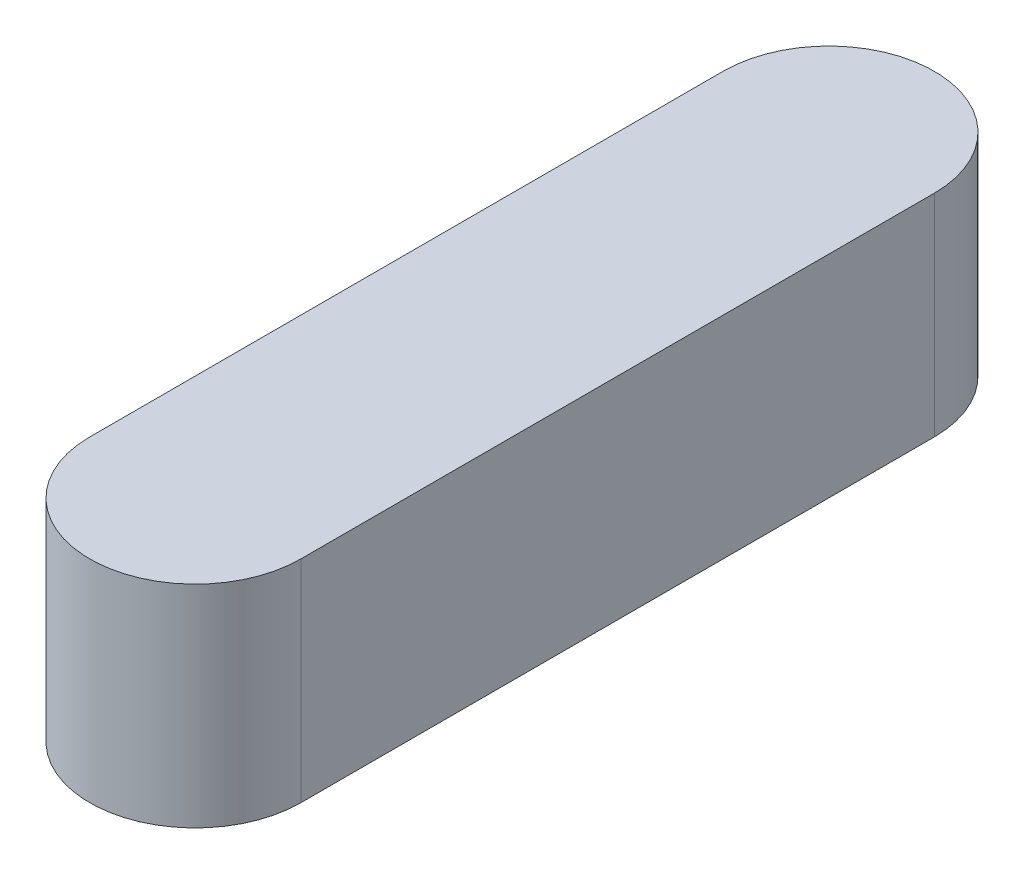
ISO-10303-21;
HEADER;
FILE_DESCRIPTION(('STEP AP214'),'2;1');
FILE_NAME('part.step','',(''),(''),'','','');
FILE_SCHEMA(('AUTOMOTIVE_DESIGN { 1 0 10303 214 1 1 1 1 }'));
ENDSEC;
DATA;
#1=APPLICATION_CONTEXT('core data for automotive mechanical design processes');
#2=APPLICATION_PROTOCOL_DEFINITION('international standard','automotive_design',2000,#1);
#3=PRODUCT_CONTEXT('',#1,'mechanical');
#4=PRODUCT('Part','Part','',(#3));
#5=PRODUCT_RELATED_PRODUCT_CATEGORY('part','',(#4));
#6=PRODUCT_DEFINITION_FORMATION('','',#4);
#7=PRODUCT_DEFINITION_CONTEXT('part definition',#1,'design');
#8=PRODUCT_DEFINITION('design','',#6,#7);
#9=PRODUCT_DEFINITION_SHAPE('','',#8);
#10=(LENGTH_UNIT() NAMED_UNIT(*) SI_UNIT(.MILLI.,.METRE.));
#11=(NAMED_UNIT(*) PLANE_ANGLE_UNIT() SI_UNIT($,.RADIAN.));
#12=(NAMED_UNIT(*) SI_UNIT($,.STERADIAN.) SOLID_ANGLE_UNIT());
#13=UNCERTAINTY_MEASURE_WITH_UNIT(LENGTH_MEASURE(1.E-05),#10,'distance_accuracy_value','');
#14=(GEOMETRIC_REPRESENTATION_CONTEXT(3) GLOBAL_UNCERTAINTY_ASSIGNED_CONTEXT((#13)) GLOBAL_UNIT_ASSIGNED_CONTEXT((#10,
#11,#12)) REPRESENTATION_CONTEXT('',''));
#15=CARTESIAN_POINT('',(0.,0.,0.));
#16=DIRECTION('',(0.,0.,1.));
#17=DIRECTION('',(1.,0.,0.));
#18=AXIS2_PLACEMENT_3D('',#15,#16,#17);
#19=CARTESIAN_POINT('',(0.,3.,0.));
#20=DIRECTION('',(0.,1.,0.));
#21=DIRECTION('',(0.,0.,1.));
#22=AXIS2_PLACEMENT_3D('',#19,#20,#21);
#23=PLANE('',#22);
#24=CARTESIAN_POINT('',(1.5,3.,10.5));
#25=DIRECTION('',(0.,1.,0.));
#26=DIRECTION('',(-1.,0.,0.));
#27=AXIS2_PLACEMENT_3D('',#24,#25,#26);
#28=CIRCLE('',#27,1.5);
#29=CARTESIAN_POINT('',(3.,3.,10.5));
#30=VERTEX_POINT('',#29);
#31=CARTESIAN_POINT('',(0.,3.,10.5));
#32=VERTEX_POINT('',#31);
#33=EDGE_CURVE('E81',#30,#32,#28,.F.);
#34=ORIENTED_EDGE('',*,*,#33,.F.);
#35=DIRECTION('',(0.,0.,-1.));
#36=VECTOR('',#35,1.);
#37=CARTESIAN_POINT('',(3.,3.,0.));
#38=LINE('',#37,#36);
#39=CARTESIAN_POINT('',(3.,3.,1.5));
#40=VERTEX_POINT('',#39);
#41=EDGE_CURVE('E60',#40,#30,#38,.F.);
#42=ORIENTED_EDGE('',*,*,#41,.F.);
#43=CARTESIAN_POINT('',(1.5,3.,1.5));
#44=DIRECTION('',(0.,-1.,0.));
#45=DIRECTION('',(1.,0.,0.));
#46=AXIS2_PLACEMENT_3D('',#43,#44,#45);
#47=CIRCLE('',#46,1.5);
#48=CARTESIAN_POINT('',(0.,3.,1.5));
#49=VERTEX_POINT('',#48);
#50=EDGE_CURVE('E20',#49,#40,#47,.T.);
#51=ORIENTED_EDGE('',*,*,#50,.F.);
#52=DIRECTION('',(0.,0.,1.));
#53=VECTOR('',#52,1.);
#54=CARTESIAN_POINT('',(0.,3.,0.));
#55=LINE('',#54,#53);
#56=EDGE_CURVE('E58',#32,#49,#55,.F.);
#57=ORIENTED_EDGE('',*,*,#56,.F.);
#58=EDGE_LOOP('',(#34,#42,#51,#57));
#59=FACE_BOUND('',#58,.T.);
#60=ADVANCED_FACE('F17',(#59),#23,.T.);
#61=CARTESIAN_POINT('',(1.5,0.75,1.5));
#62=DIRECTION('',(0.,-1.,0.));
#63=DIRECTION('',(1.,0.,0.));
#64=AXIS2_PLACEMENT_3D('',#61,#62,#63);
#65=CYLINDRICAL_SURFACE('',#64,1.5);
#66=ORIENTED_EDGE('',*,*,#50,.T.);
#67=DIRECTION('',(0.,1.,0.));
#68=VECTOR('',#67,1.);
#69=CARTESIAN_POINT('',(3.,3.,1.5));
#70=LINE('',#69,#68);
#71=CARTESIAN_POINT('',(3.,0.,1.5));
#72=VERTEX_POINT('',#71);
#73=EDGE_CURVE('E63',#72,#40,#70,.T.);
#74=ORIENTED_EDGE('',*,*,#73,.F.);
#75=CARTESIAN_POINT('',(1.5,0.,1.5));
#76=DIRECTION('',(0.,-1.,0.));
#77=DIRECTION('',(1.,0.,0.));
#78=AXIS2_PLACEMENT_3D('',#75,#76,#77);
#79=CIRCLE('',#78,1.5);
#80=CARTESIAN_POINT('',(0.,0.,1.5));
#81=VERTEX_POINT('',#80);
#82=EDGE_CURVE('E68',#81,#72,#79,.T.);
#83=ORIENTED_EDGE('',*,*,#82,.F.);
#84=DIRECTION('',(0.,1.,0.));
#85=VECTOR('',#84,1.);
#86=CARTESIAN_POINT('',(0.,0.,1.5));
#87=LINE('',#86,#85);
#88=EDGE_CURVE('E65',#49,#81,#87,.F.);
#89=ORIENTED_EDGE('',*,*,#88,.F.);
#90=EDGE_LOOP('',(#66,#74,#83,#89));
#91=FACE_BOUND('',#90,.T.);
#92=ADVANCED_FACE('F66',(#91),#65,.T.);
#93=CARTESIAN_POINT('',(3.,3.,0.));
#94=DIRECTION('',(1.,0.,0.));
#95=DIRECTION('',(0.,0.,-1.));
#96=AXIS2_PLACEMENT_3D('',#93,#94,#95);
#97=PLANE('',#96);
#98=DIRECTION('',(0.,1.,0.));
#99=VECTOR('',#98,1.);
#100=CARTESIAN_POINT('',(3.,0.75,10.5));
#101=LINE('',#100,#99);
#102=CARTESIAN_POINT('',(3.,0.,10.5));
#103=VERTEX_POINT('',#102);
#104=EDGE_CURVE('E70',#103,#30,#101,.T.);
#105=ORIENTED_EDGE('',*,*,#104,.F.);
#106=DIRECTION('',(0.,0.,-1.));
#107=VECTOR('',#106,1.);
#108=CARTESIAN_POINT('',(3.,0.,0.));
#109=LINE('',#108,#107);
#110=EDGE_CURVE('E74',#72,#103,#109,.F.);
#111=ORIENTED_EDGE('',*,*,#110,.F.);
#112=ORIENTED_EDGE('',*,*,#73,.T.);
#113=ORIENTED_EDGE('',*,*,#41,.T.);
#114=EDGE_LOOP('',(#105,#111,#112,#113));
#115=FACE_BOUND('',#114,.T.);
#116=ADVANCED_FACE('F90',(#115),#97,.T.);
#117=CARTESIAN_POINT('',(1.5,0.75,10.5));
#118=DIRECTION('',(0.,1.,0.));
#119=DIRECTION('',(-1.,0.,0.));
#120=AXIS2_PLACEMENT_3D('',#117,#118,#119);
#121=CYLINDRICAL_SURFACE('',#120,1.5);
#122=CARTESIAN_POINT('',(1.5,0.,10.5));
#123=DIRECTION('',(0.,1.,0.));
#124=DIRECTION('',(-1.,0.,0.));
#125=AXIS2_PLACEMENT_3D('',#122,#123,#124);
#126=CIRCLE('',#125,1.5);
#127=CARTESIAN_POINT('',(0.,0.,10.5));
#128=VERTEX_POINT('',#127);
#129=EDGE_CURVE('E26',#103,#128,#126,.F.);
#130=ORIENTED_EDGE('',*,*,#129,.F.);
#131=ORIENTED_EDGE('',*,*,#104,.T.);
#132=ORIENTED_EDGE('',*,*,#33,.T.);
#133=DIRECTION('',(0.,1.,0.));
#134=VECTOR('',#133,1.);
#135=CARTESIAN_POINT('',(0.,0.,10.5));
#136=LINE('',#135,#134);
#137=EDGE_CURVE('E35',#128,#32,#136,.T.);
#138=ORIENTED_EDGE('',*,*,#137,.F.);
#139=EDGE_LOOP('',(#130,#131,#132,#138));
#140=FACE_BOUND('',#139,.T.);
#141=ADVANCED_FACE('F91',(#140),#121,.T.);
#142=CARTESIAN_POINT('',(0.,0.,0.));
#143=DIRECTION('',(-1.,0.,0.));
#144=DIRECTION('',(0.,0.,1.));
#145=AXIS2_PLACEMENT_3D('',#142,#143,#144);
#146=PLANE('',#145);
#147=ORIENTED_EDGE('',*,*,#137,.T.);
#148=ORIENTED_EDGE('',*,*,#56,.T.);
#149=ORIENTED_EDGE('',*,*,#88,.T.);
#150=DIRECTION('',(0.,0.,-1.));
#151=VECTOR('',#150,1.);
#152=CARTESIAN_POINT('',(0.,0.,0.));
#153=LINE('',#152,#151);
#154=EDGE_CURVE('E11',#128,#81,#153,.T.);
#155=ORIENTED_EDGE('',*,*,#154,.F.);
#156=EDGE_LOOP('',(#147,#148,#149,#155));
#157=FACE_BOUND('',#156,.T.);
#158=ADVANCED_FACE('F72',(#157),#146,.T.);
#159=CARTESIAN_POINT('',(3.,0.,0.));
#160=DIRECTION('',(0.,-1.,0.));
#161=DIRECTION('',(0.,0.,-1.));
#162=AXIS2_PLACEMENT_3D('',#159,#160,#161);
#163=PLANE('',#162);
#164=ORIENTED_EDGE('',*,*,#129,.T.);
#165=ORIENTED_EDGE('',*,*,#154,.T.);
#166=ORIENTED_EDGE('',*,*,#82,.T.);
#167=ORIENTED_EDGE('',*,*,#110,.T.);
#168=EDGE_LOOP('',(#164,#165,#166,#167));
#169=FACE_BOUND('',#168,.T.);
#170=ADVANCED_FACE('F88',(#169),#163,.T.);
#171=CLOSED_SHELL('',(#60,#92,#116,#141,#158,#170));
#172=MANIFOLD_SOLID_BREP('B1',#171);
#173=ADVANCED_BREP_SHAPE_REPRESENTATION('',(#18,#172),#14);
#174=SHAPE_DEFINITION_REPRESENTATION(#9,#173);
ENDSEC;
END-ISO-10303-21;
